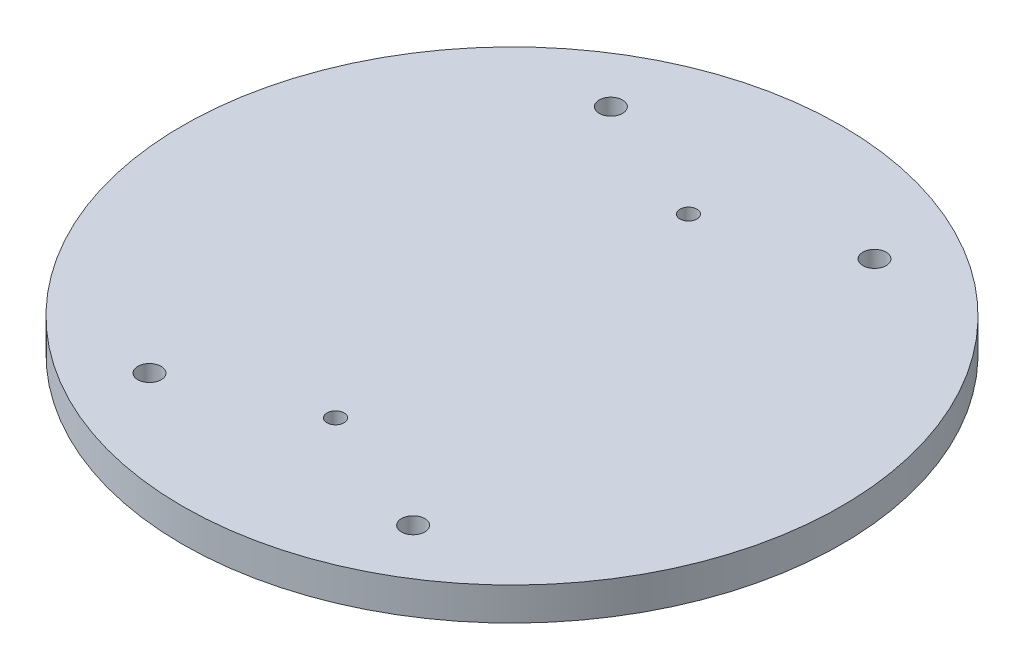
ISO-10303-21;
HEADER;
FILE_DESCRIPTION(('STEP AP214'),'2;1');
FILE_NAME('part.step','',(''),(''),'','','');
FILE_SCHEMA(('AUTOMOTIVE_DESIGN { 1 0 10303 214 1 1 1 1 }'));
ENDSEC;
DATA;
#1=APPLICATION_CONTEXT('core data for automotive mechanical design processes');
#2=APPLICATION_PROTOCOL_DEFINITION('international standard','automotive_design',2000,#1);
#3=PRODUCT_CONTEXT('',#1,'mechanical');
#4=PRODUCT('Part','Part','',(#3));
#5=PRODUCT_RELATED_PRODUCT_CATEGORY('part','',(#4));
#6=PRODUCT_DEFINITION_FORMATION('','',#4);
#7=PRODUCT_DEFINITION_CONTEXT('part definition',#1,'design');
#8=PRODUCT_DEFINITION('design','',#6,#7);
#9=PRODUCT_DEFINITION_SHAPE('','',#8);
#10=(LENGTH_UNIT() NAMED_UNIT(*) SI_UNIT(.MILLI.,.METRE.));
#11=(NAMED_UNIT(*) PLANE_ANGLE_UNIT() SI_UNIT($,.RADIAN.));
#12=(NAMED_UNIT(*) SI_UNIT($,.STERADIAN.) SOLID_ANGLE_UNIT());
#13=UNCERTAINTY_MEASURE_WITH_UNIT(LENGTH_MEASURE(1.E-05),#10,'distance_accuracy_value','');
#14=(GEOMETRIC_REPRESENTATION_CONTEXT(3) GLOBAL_UNCERTAINTY_ASSIGNED_CONTEXT((#13)) GLOBAL_UNIT_ASSIGNED_CONTEXT((#10,
#11,#12)) REPRESENTATION_CONTEXT('',''));
#15=CARTESIAN_POINT('',(0.,0.,0.));
#16=DIRECTION('',(0.,0.,1.));
#17=DIRECTION('',(1.,0.,0.));
#18=AXIS2_PLACEMENT_3D('',#15,#16,#17);
#19=CARTESIAN_POINT('',(0.,6.35,0.));
#20=DIRECTION('',(0.,-1.,0.));
#21=DIRECTION('',(0.,0.,-1.));
#22=AXIS2_PLACEMENT_3D('',#19,#20,#21);
#23=CYLINDRICAL_SURFACE('',#22,63.5);
#24=CARTESIAN_POINT('',(0.,6.35,0.));
#25=DIRECTION('',(0.,1.,0.));
#26=DIRECTION('',(0.,0.,1.));
#27=AXIS2_PLACEMENT_3D('',#24,#25,#26);
#28=CIRCLE('',#27,63.5);
#29=CARTESIAN_POINT('',(0.,6.35,63.5));
#30=VERTEX_POINT('',#29);
#31=EDGE_CURVE('E10',#30,#30,#28,.T.);
#32=ORIENTED_EDGE('',*,*,#31,.F.);
#33=EDGE_LOOP('',(#32));
#34=FACE_BOUND('',#33,.T.);
#35=CARTESIAN_POINT('',(0.,0.,0.));
#36=DIRECTION('',(0.,1.,0.));
#37=DIRECTION('',(0.,0.,1.));
#38=AXIS2_PLACEMENT_3D('',#35,#36,#37);
#39=CIRCLE('',#38,63.5);
#40=CARTESIAN_POINT('',(0.,0.,63.5));
#41=VERTEX_POINT('',#40);
#42=EDGE_CURVE('E42',#41,#41,#39,.T.);
#43=ORIENTED_EDGE('',*,*,#42,.T.);
#44=EDGE_LOOP('',(#43));
#45=FACE_BOUND('',#44,.T.);
#46=ADVANCED_FACE('F39',(#34,#45),#23,.T.);
#47=CARTESIAN_POINT('',(0.,6.35,0.));
#48=DIRECTION('',(0.,1.,0.));
#49=DIRECTION('',(0.,0.,1.));
#50=AXIS2_PLACEMENT_3D('',#47,#48,#49);
#51=PLANE('',#50);
#52=CARTESIAN_POINT('',(0.,6.35,-34.));
#53=DIRECTION('',(0.,1.,0.));
#54=DIRECTION('',(0.,0.,1.));
#55=AXIS2_PLACEMENT_3D('',#52,#53,#54);
#56=CIRCLE('',#55,1.65);
#57=CARTESIAN_POINT('',(0.,6.35,-32.35));
#58=VERTEX_POINT('',#57);
#59=EDGE_CURVE('E83',#58,#58,#56,.T.);
#60=ORIENTED_EDGE('',*,*,#59,.F.);
#61=EDGE_LOOP('',(#60));
#62=FACE_BOUND('',#61,.T.);
#63=CARTESIAN_POINT('',(0.,6.35,34.));
#64=DIRECTION('',(0.,1.,0.));
#65=DIRECTION('',(0.,0.,1.));
#66=AXIS2_PLACEMENT_3D('',#63,#64,#65);
#67=CIRCLE('',#66,1.65);
#68=CARTESIAN_POINT('',(0.,6.35,35.65));
#69=VERTEX_POINT('',#68);
#70=EDGE_CURVE('E77',#69,#69,#67,.T.);
#71=ORIENTED_EDGE('',*,*,#70,.F.);
#72=EDGE_LOOP('',(#71));
#73=FACE_BOUND('',#72,.T.);
#74=CARTESIAN_POINT('',(-25.4,6.35,44.4500000000001));
#75=DIRECTION('',(0.,1.,0.));
#76=DIRECTION('',(0.,0.,1.));
#77=AXIS2_PLACEMENT_3D('',#74,#75,#76);
#78=CIRCLE('',#77,2.2479);
#79=CARTESIAN_POINT('',(-25.4,6.35,46.6979000000001));
#80=VERTEX_POINT('',#79);
#81=EDGE_CURVE('E71',#80,#80,#78,.T.);
#82=ORIENTED_EDGE('',*,*,#81,.F.);
#83=EDGE_LOOP('',(#82));
#84=FACE_BOUND('',#83,.T.);
#85=CARTESIAN_POINT('',(25.4,6.35,44.4500000000001));
#86=DIRECTION('',(0.,1.,0.));
#87=DIRECTION('',(0.,0.,1.));
#88=AXIS2_PLACEMENT_3D('',#85,#86,#87);
#89=CIRCLE('',#88,2.2479);
#90=CARTESIAN_POINT('',(25.4,6.35,46.6979000000001));
#91=VERTEX_POINT('',#90);
#92=EDGE_CURVE('E65',#91,#91,#89,.T.);
#93=ORIENTED_EDGE('',*,*,#92,.F.);
#94=EDGE_LOOP('',(#93));
#95=FACE_BOUND('',#94,.T.);
#96=CARTESIAN_POINT('',(25.4,6.35,-44.45));
#97=DIRECTION('',(0.,1.,0.));
#98=DIRECTION('',(0.,0.,1.));
#99=AXIS2_PLACEMENT_3D('',#96,#97,#98);
#100=CIRCLE('',#99,2.2479);
#101=CARTESIAN_POINT('',(25.4,6.35,-42.2021));
#102=VERTEX_POINT('',#101);
#103=EDGE_CURVE('E59',#102,#102,#100,.T.);
#104=ORIENTED_EDGE('',*,*,#103,.F.);
#105=EDGE_LOOP('',(#104));
#106=FACE_BOUND('',#105,.T.);
#107=CARTESIAN_POINT('',(-25.4,6.35,-44.4499999999999));
#108=DIRECTION('',(0.,1.,0.));
#109=DIRECTION('',(0.,0.,1.));
#110=AXIS2_PLACEMENT_3D('',#107,#108,#109);
#111=CIRCLE('',#110,2.2479);
#112=CARTESIAN_POINT('',(-25.4,6.35,-42.2021));
#113=VERTEX_POINT('',#112);
#114=EDGE_CURVE('E53',#113,#113,#111,.T.);
#115=ORIENTED_EDGE('',*,*,#114,.F.);
#116=EDGE_LOOP('',(#115));
#117=FACE_BOUND('',#116,.T.);
#118=ORIENTED_EDGE('',*,*,#31,.T.);
#119=EDGE_LOOP('',(#118));
#120=FACE_BOUND('',#119,.T.);
#121=ADVANCED_FACE('F89',(#62,#73,#84,#95,#106,#117,#120),#51,.T.);
#122=CARTESIAN_POINT('',(0.,0.,0.));
#123=DIRECTION('',(0.,1.,0.));
#124=DIRECTION('',(0.,0.,1.));
#125=AXIS2_PLACEMENT_3D('',#122,#123,#124);
#126=PLANE('',#125);
#127=CARTESIAN_POINT('',(0.,0.,-34.));
#128=DIRECTION('',(0.,1.,0.));
#129=DIRECTION('',(0.,0.,1.));
#130=AXIS2_PLACEMENT_3D('',#127,#128,#129);
#131=CIRCLE('',#130,1.65);
#132=CARTESIAN_POINT('',(0.,0.,-32.35));
#133=VERTEX_POINT('',#132);
#134=EDGE_CURVE('E80',#133,#133,#131,.T.);
#135=ORIENTED_EDGE('',*,*,#134,.T.);
#136=EDGE_LOOP('',(#135));
#137=FACE_BOUND('',#136,.T.);
#138=CARTESIAN_POINT('',(0.,0.,34.));
#139=DIRECTION('',(0.,1.,0.));
#140=DIRECTION('',(0.,0.,1.));
#141=AXIS2_PLACEMENT_3D('',#138,#139,#140);
#142=CIRCLE('',#141,1.65);
#143=CARTESIAN_POINT('',(0.,0.,35.65));
#144=VERTEX_POINT('',#143);
#145=EDGE_CURVE('E74',#144,#144,#142,.T.);
#146=ORIENTED_EDGE('',*,*,#145,.T.);
#147=EDGE_LOOP('',(#146));
#148=FACE_BOUND('',#147,.T.);
#149=CARTESIAN_POINT('',(-25.4,0.,44.4500000000001));
#150=DIRECTION('',(0.,1.,0.));
#151=DIRECTION('',(0.,0.,1.));
#152=AXIS2_PLACEMENT_3D('',#149,#150,#151);
#153=CIRCLE('',#152,2.2479);
#154=CARTESIAN_POINT('',(-25.4,0.,46.6979000000001));
#155=VERTEX_POINT('',#154);
#156=EDGE_CURVE('E68',#155,#155,#153,.T.);
#157=ORIENTED_EDGE('',*,*,#156,.T.);
#158=EDGE_LOOP('',(#157));
#159=FACE_BOUND('',#158,.T.);
#160=CARTESIAN_POINT('',(25.4,0.,44.4500000000001));
#161=DIRECTION('',(0.,1.,0.));
#162=DIRECTION('',(0.,0.,1.));
#163=AXIS2_PLACEMENT_3D('',#160,#161,#162);
#164=CIRCLE('',#163,2.2479);
#165=CARTESIAN_POINT('',(25.4,0.,46.6979000000001));
#166=VERTEX_POINT('',#165);
#167=EDGE_CURVE('E62',#166,#166,#164,.T.);
#168=ORIENTED_EDGE('',*,*,#167,.T.);
#169=EDGE_LOOP('',(#168));
#170=FACE_BOUND('',#169,.T.);
#171=CARTESIAN_POINT('',(25.4,0.,-44.45));
#172=DIRECTION('',(0.,1.,0.));
#173=DIRECTION('',(0.,0.,1.));
#174=AXIS2_PLACEMENT_3D('',#171,#172,#173);
#175=CIRCLE('',#174,2.2479);
#176=CARTESIAN_POINT('',(25.4,0.,-42.2021));
#177=VERTEX_POINT('',#176);
#178=EDGE_CURVE('E56',#177,#177,#175,.T.);
#179=ORIENTED_EDGE('',*,*,#178,.T.);
#180=EDGE_LOOP('',(#179));
#181=FACE_BOUND('',#180,.T.);
#182=CARTESIAN_POINT('',(-25.4,0.,-44.4499999999999));
#183=DIRECTION('',(0.,1.,0.));
#184=DIRECTION('',(0.,0.,1.));
#185=AXIS2_PLACEMENT_3D('',#182,#183,#184);
#186=CIRCLE('',#185,2.2479);
#187=CARTESIAN_POINT('',(-25.4,0.,-42.2021));
#188=VERTEX_POINT('',#187);
#189=EDGE_CURVE('E49',#188,#188,#186,.T.);
#190=ORIENTED_EDGE('',*,*,#189,.T.);
#191=EDGE_LOOP('',(#190));
#192=FACE_BOUND('',#191,.T.);
#193=ORIENTED_EDGE('',*,*,#42,.F.);
#194=EDGE_LOOP('',(#193));
#195=FACE_BOUND('',#194,.T.);
#196=ADVANCED_FACE('F92',(#137,#148,#159,#170,#181,#192,#195),#126,.F.);
#197=CARTESIAN_POINT('',(-25.4,6.35,-44.4499999999999));
#198=DIRECTION('',(0.,1.,0.));
#199=DIRECTION('',(0.,0.,1.));
#200=AXIS2_PLACEMENT_3D('',#197,#198,#199);
#201=CYLINDRICAL_SURFACE('',#200,2.2479);
#202=ORIENTED_EDGE('',*,*,#189,.F.);
#203=EDGE_LOOP('',(#202));
#204=FACE_BOUND('',#203,.T.);
#205=ORIENTED_EDGE('',*,*,#114,.T.);
#206=EDGE_LOOP('',(#205));
#207=FACE_BOUND('',#206,.T.);
#208=ADVANCED_FACE('F104',(#204,#207),#201,.F.);
#209=CARTESIAN_POINT('',(25.4,6.35,-44.45));
#210=DIRECTION('',(0.,1.,0.));
#211=DIRECTION('',(0.,0.,1.));
#212=AXIS2_PLACEMENT_3D('',#209,#210,#211);
#213=CYLINDRICAL_SURFACE('',#212,2.2479);
#214=ORIENTED_EDGE('',*,*,#178,.F.);
#215=EDGE_LOOP('',(#214));
#216=FACE_BOUND('',#215,.T.);
#217=ORIENTED_EDGE('',*,*,#103,.T.);
#218=EDGE_LOOP('',(#217));
#219=FACE_BOUND('',#218,.T.);
#220=ADVANCED_FACE('F106',(#216,#219),#213,.F.);
#221=CARTESIAN_POINT('',(25.4,6.35,44.4500000000001));
#222=DIRECTION('',(0.,1.,0.));
#223=DIRECTION('',(0.,0.,1.));
#224=AXIS2_PLACEMENT_3D('',#221,#222,#223);
#225=CYLINDRICAL_SURFACE('',#224,2.2479);
#226=ORIENTED_EDGE('',*,*,#167,.F.);
#227=EDGE_LOOP('',(#226));
#228=FACE_BOUND('',#227,.T.);
#229=ORIENTED_EDGE('',*,*,#92,.T.);
#230=EDGE_LOOP('',(#229));
#231=FACE_BOUND('',#230,.T.);
#232=ADVANCED_FACE('F113',(#228,#231),#225,.F.);
#233=CARTESIAN_POINT('',(-25.4,6.35,44.4500000000001));
#234=DIRECTION('',(0.,1.,0.));
#235=DIRECTION('',(0.,0.,1.));
#236=AXIS2_PLACEMENT_3D('',#233,#234,#235);
#237=CYLINDRICAL_SURFACE('',#236,2.2479);
#238=ORIENTED_EDGE('',*,*,#156,.F.);
#239=EDGE_LOOP('',(#238));
#240=FACE_BOUND('',#239,.T.);
#241=ORIENTED_EDGE('',*,*,#81,.T.);
#242=EDGE_LOOP('',(#241));
#243=FACE_BOUND('',#242,.T.);
#244=ADVANCED_FACE('F148',(#240,#243),#237,.F.);
#245=CARTESIAN_POINT('',(0.,6.35,34.));
#246=DIRECTION('',(0.,1.,0.));
#247=DIRECTION('',(0.,0.,1.));
#248=AXIS2_PLACEMENT_3D('',#245,#246,#247);
#249=CYLINDRICAL_SURFACE('',#248,1.65);
#250=ORIENTED_EDGE('',*,*,#145,.F.);
#251=EDGE_LOOP('',(#250));
#252=FACE_BOUND('',#251,.T.);
#253=ORIENTED_EDGE('',*,*,#70,.T.);
#254=EDGE_LOOP('',(#253));
#255=FACE_BOUND('',#254,.T.);
#256=ADVANCED_FACE('F155',(#252,#255),#249,.F.);
#257=CARTESIAN_POINT('',(0.,6.35,-34.));
#258=DIRECTION('',(0.,1.,0.));
#259=DIRECTION('',(0.,0.,1.));
#260=AXIS2_PLACEMENT_3D('',#257,#258,#259);
#261=CYLINDRICAL_SURFACE('',#260,1.65);
#262=ORIENTED_EDGE('',*,*,#134,.F.);
#263=EDGE_LOOP('',(#262));
#264=FACE_BOUND('',#263,.T.);
#265=ORIENTED_EDGE('',*,*,#59,.T.);
#266=EDGE_LOOP('',(#265));
#267=FACE_BOUND('',#266,.T.);
#268=ADVANCED_FACE('F87',(#264,#267),#261,.F.);
#269=CLOSED_SHELL('',(#46,#121,#196,#208,#220,#232,#244,#256,#268));
#270=MANIFOLD_SOLID_BREP('B2',#269);
#271=ADVANCED_BREP_SHAPE_REPRESENTATION('',(#18,#270),#14);
#272=SHAPE_DEFINITION_REPRESENTATION(#9,#271);
ENDSEC;
END-ISO-10303-21;
